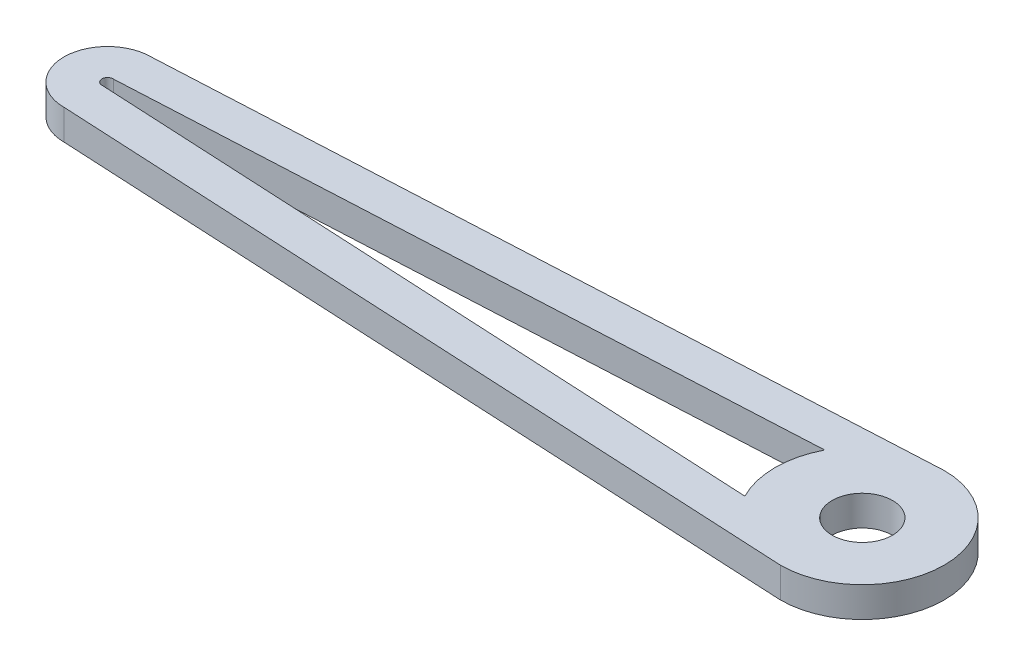
ISO-10303-21;
HEADER;
FILE_DESCRIPTION(('STEP AP214'),'2;1');
FILE_NAME('part.step','',(''),(''),'','','');
FILE_SCHEMA(('AUTOMOTIVE_DESIGN { 1 0 10303 214 1 1 1 1 }'));
ENDSEC;
DATA;
#1=APPLICATION_CONTEXT('core data for automotive mechanical design processes');
#2=APPLICATION_PROTOCOL_DEFINITION('international standard','automotive_design',2000,#1);
#3=PRODUCT_CONTEXT('',#1,'mechanical');
#4=PRODUCT('Part','Part','',(#3));
#5=PRODUCT_RELATED_PRODUCT_CATEGORY('part','',(#4));
#6=PRODUCT_DEFINITION_FORMATION('','',#4);
#7=PRODUCT_DEFINITION_CONTEXT('part definition',#1,'design');
#8=PRODUCT_DEFINITION('design','',#6,#7);
#9=PRODUCT_DEFINITION_SHAPE('','',#8);
#10=(LENGTH_UNIT() NAMED_UNIT(*) SI_UNIT(.MILLI.,.METRE.));
#11=(NAMED_UNIT(*) PLANE_ANGLE_UNIT() SI_UNIT($,.RADIAN.));
#12=(NAMED_UNIT(*) SI_UNIT($,.STERADIAN.) SOLID_ANGLE_UNIT());
#13=UNCERTAINTY_MEASURE_WITH_UNIT(LENGTH_MEASURE(1.E-05),#10,'distance_accuracy_value','');
#14=(GEOMETRIC_REPRESENTATION_CONTEXT(3) GLOBAL_UNCERTAINTY_ASSIGNED_CONTEXT((#13)) GLOBAL_UNIT_ASSIGNED_CONTEXT((#10,
#11,#12)) REPRESENTATION_CONTEXT('',''));
#15=CARTESIAN_POINT('',(0.,0.,0.));
#16=DIRECTION('',(0.,0.,1.));
#17=DIRECTION('',(1.,0.,0.));
#18=AXIS2_PLACEMENT_3D('',#15,#16,#17);
#19=CARTESIAN_POINT('',(-18.7071955690592,0.79375,0.));
#20=DIRECTION('',(0.,1.,0.));
#21=DIRECTION('',(0.,0.,1.));
#22=AXIS2_PLACEMENT_3D('',#19,#20,#21);
#23=PLANE('',#22);
#24=CARTESIAN_POINT('',(21.,0.79375,0.));
#25=DIRECTION('',(0.,1.,0.));
#26=DIRECTION('',(0.,0.,1.));
#27=AXIS2_PLACEMENT_3D('',#24,#25,#26);
#28=CIRCLE('',#27,1.5875);
#29=CARTESIAN_POINT('',(21.,0.79375,1.58749999999999));
#30=VERTEX_POINT('',#29);
#31=EDGE_CURVE('E134',#30,#30,#28,.T.);
#32=ORIENTED_EDGE('',*,*,#31,.F.);
#33=EDGE_LOOP('',(#32));
#34=FACE_BOUND('',#33,.T.);
#35=CARTESIAN_POINT('',(-18.7071955690592,0.79375,0.));
#36=DIRECTION('',(0.,1.,0.));
#37=DIRECTION('',(0.,0.,1.));
#38=AXIS2_PLACEMENT_3D('',#35,#36,#37);
#39=CIRCLE('',#38,2.29280443094082);
#40=CARTESIAN_POINT('',(-18.7071955690592,0.79375,-2.29280443094082));
#41=VERTEX_POINT('',#40);
#42=CARTESIAN_POINT('',(-18.7071955690592,0.79375,2.29280443094082));
#43=VERTEX_POINT('',#42);
#44=EDGE_CURVE('E140',#41,#43,#39,.T.);
#45=ORIENTED_EDGE('',*,*,#44,.T.);
#46=DIRECTION('',(0.998710837112563,0.,0.0507608494208332));
#47=VECTOR('',#46,1.);
#48=CARTESIAN_POINT('',(-18.7071955690592,0.79375,2.29280443094082));
#49=LINE('',#48,#47);
#50=CARTESIAN_POINT('',(21.,0.79375,4.31097715952754));
#51=VERTEX_POINT('',#50);
#52=EDGE_CURVE('E143',#43,#51,#49,.T.);
#53=ORIENTED_EDGE('',*,*,#52,.T.);
#54=CARTESIAN_POINT('',(21.,0.79375,0.));
#55=DIRECTION('',(0.,1.,0.));
#56=DIRECTION('',(0.,0.,1.));
#57=AXIS2_PLACEMENT_3D('',#54,#55,#56);
#58=CIRCLE('',#57,4.31097715952755);
#59=CARTESIAN_POINT('',(21.,0.79375,-4.31097715952756));
#60=VERTEX_POINT('',#59);
#61=EDGE_CURVE('E146',#51,#60,#58,.T.);
#62=ORIENTED_EDGE('',*,*,#61,.T.);
#63=DIRECTION('',(-0.998710837112563,0.,0.0507608494208336));
#64=VECTOR('',#63,1.);
#65=CARTESIAN_POINT('',(-18.7071955690592,0.79375,-2.29280443094082));
#66=LINE('',#65,#64);
#67=EDGE_CURVE('E148',#60,#41,#66,.T.);
#68=ORIENTED_EDGE('',*,*,#67,.T.);
#69=EDGE_LOOP('',(#45,#53,#62,#68));
#70=FACE_BOUND('',#69,.T.);
#71=DIRECTION('',(0.998710837112562,0.,0.0507608494208332));
#72=VECTOR('',#71,1.);
#73=CARTESIAN_POINT('',(-18.6804625738071,0.79375,0.291581518178759));
#74=LINE('',#73,#72);
#75=CARTESIAN_POINT('',(-18.6804625738071,0.79375,0.291581518178759));
#76=VERTEX_POINT('',#75);
#77=CARTESIAN_POINT('',(16.9219567332854,0.79375,2.10112335782638));
#78=VERTEX_POINT('',#77);
#79=EDGE_CURVE('E106',#76,#78,#74,.T.);
#80=ORIENTED_EDGE('',*,*,#79,.F.);
#81=CARTESIAN_POINT('',(-18.7071955690592,0.79375,0.));
#82=DIRECTION('',(0.,1.,0.));
#83=DIRECTION('',(0.,0.,1.));
#84=AXIS2_PLACEMENT_3D('',#81,#82,#83);
#85=CIRCLE('',#84,0.292804430940822);
#86=CARTESIAN_POINT('',(-18.6804625738071,0.79375,-0.291581518178759));
#87=VERTEX_POINT('',#86);
#88=EDGE_CURVE('E98',#87,#76,#85,.T.);
#89=ORIENTED_EDGE('',*,*,#88,.F.);
#90=DIRECTION('',(-0.998710837112562,0.,0.0507608494208336));
#91=VECTOR('',#90,1.);
#92=CARTESIAN_POINT('',(-18.6804625738071,0.79375,-0.291581518178759));
#93=LINE('',#92,#91);
#94=CARTESIAN_POINT('',(16.9219567332854,0.79375,-2.1011233578264));
#95=VERTEX_POINT('',#94);
#96=EDGE_CURVE('E120',#95,#87,#93,.T.);
#97=ORIENTED_EDGE('',*,*,#96,.F.);
#98=CARTESIAN_POINT('',(21.,0.79375,0.));
#99=DIRECTION('',(0.,-1.,0.));
#100=DIRECTION('',(0.,0.,1.));
#101=AXIS2_PLACEMENT_3D('',#98,#99,#100);
#102=CIRCLE('',#101,4.5875);
#103=EDGE_CURVE('E118',#78,#95,#102,.T.);
#104=ORIENTED_EDGE('',*,*,#103,.F.);
#105=EDGE_LOOP('',(#80,#89,#97,#104));
#106=FACE_BOUND('',#105,.T.);
#107=ADVANCED_FACE('F33',(#34,#70,#106),#23,.T.);
#108=CARTESIAN_POINT('',(-18.7071955690592,-0.79375,0.));
#109=DIRECTION('',(0.,1.,0.));
#110=DIRECTION('',(0.,0.,1.));
#111=AXIS2_PLACEMENT_3D('',#108,#109,#110);
#112=PLANE('',#111);
#113=CARTESIAN_POINT('',(21.,-0.79375,0.));
#114=DIRECTION('',(0.,1.,0.));
#115=DIRECTION('',(0.,0.,1.));
#116=AXIS2_PLACEMENT_3D('',#113,#114,#115);
#117=CIRCLE('',#116,1.5875);
#118=CARTESIAN_POINT('',(21.,-0.79375,1.58749999999999));
#119=VERTEX_POINT('',#118);
#120=EDGE_CURVE('E114',#119,#119,#117,.T.);
#121=ORIENTED_EDGE('',*,*,#120,.T.);
#122=EDGE_LOOP('',(#121));
#123=FACE_BOUND('',#122,.T.);
#124=CARTESIAN_POINT('',(-18.7071955690592,-0.79375,0.));
#125=DIRECTION('',(0.,1.,0.));
#126=DIRECTION('',(0.,0.,1.));
#127=AXIS2_PLACEMENT_3D('',#124,#125,#126);
#128=CIRCLE('',#127,2.29280443094082);
#129=CARTESIAN_POINT('',(-18.7071955690592,-0.79375,-2.29280443094082));
#130=VERTEX_POINT('',#129);
#131=CARTESIAN_POINT('',(-18.7071955690592,-0.79375,2.29280443094082));
#132=VERTEX_POINT('',#131);
#133=EDGE_CURVE('E137',#130,#132,#128,.T.);
#134=ORIENTED_EDGE('',*,*,#133,.F.);
#135=DIRECTION('',(-0.998710837112563,0.,0.0507608494208336));
#136=VECTOR('',#135,1.);
#137=CARTESIAN_POINT('',(-18.7071955690592,-0.79375,-2.29280443094082));
#138=LINE('',#137,#136);
#139=CARTESIAN_POINT('',(21.,-0.79375,-4.31097715952756));
#140=VERTEX_POINT('',#139);
#141=EDGE_CURVE('E144',#140,#130,#138,.T.);
#142=ORIENTED_EDGE('',*,*,#141,.F.);
#143=CARTESIAN_POINT('',(21.,-0.79375,0.));
#144=DIRECTION('',(0.,1.,0.));
#145=DIRECTION('',(0.,0.,1.));
#146=AXIS2_PLACEMENT_3D('',#143,#144,#145);
#147=CIRCLE('',#146,4.31097715952755);
#148=CARTESIAN_POINT('',(21.,-0.79375,4.31097715952754));
#149=VERTEX_POINT('',#148);
#150=EDGE_CURVE('E155',#149,#140,#147,.T.);
#151=ORIENTED_EDGE('',*,*,#150,.F.);
#152=DIRECTION('',(0.998710837112563,0.,0.0507608494208332));
#153=VECTOR('',#152,1.);
#154=CARTESIAN_POINT('',(-18.7071955690592,-0.79375,2.29280443094082));
#155=LINE('',#154,#153);
#156=EDGE_CURVE('E153',#132,#149,#155,.T.);
#157=ORIENTED_EDGE('',*,*,#156,.F.);
#158=EDGE_LOOP('',(#134,#142,#151,#157));
#159=FACE_BOUND('',#158,.T.);
#160=CARTESIAN_POINT('',(-18.7071955690592,-0.79375,0.));
#161=DIRECTION('',(0.,1.,0.));
#162=DIRECTION('',(0.,0.,1.));
#163=AXIS2_PLACEMENT_3D('',#160,#161,#162);
#164=CIRCLE('',#163,0.292804430940822);
#165=CARTESIAN_POINT('',(-18.6804625738071,-0.79375,-0.291581518178759));
#166=VERTEX_POINT('',#165);
#167=CARTESIAN_POINT('',(-18.6804625738071,-0.79375,0.291581518178759));
#168=VERTEX_POINT('',#167);
#169=EDGE_CURVE('E56',#166,#168,#164,.T.);
#170=ORIENTED_EDGE('',*,*,#169,.T.);
#171=DIRECTION('',(0.998710837112562,0.,0.0507608494208332));
#172=VECTOR('',#171,1.);
#173=CARTESIAN_POINT('',(-18.6804625738071,-0.79375,0.291581518178759));
#174=LINE('',#173,#172);
#175=CARTESIAN_POINT('',(16.9219567332854,-0.79375,2.10112335782638));
#176=VERTEX_POINT('',#175);
#177=EDGE_CURVE('E113',#168,#176,#174,.T.);
#178=ORIENTED_EDGE('',*,*,#177,.T.);
#179=CARTESIAN_POINT('',(21.,-0.79375,0.));
#180=DIRECTION('',(0.,-1.,0.));
#181=DIRECTION('',(0.,0.,1.));
#182=AXIS2_PLACEMENT_3D('',#179,#180,#181);
#183=CIRCLE('',#182,4.5875);
#184=CARTESIAN_POINT('',(16.9219567332854,-0.79375,-2.1011233578264));
#185=VERTEX_POINT('',#184);
#186=EDGE_CURVE('E126',#176,#185,#183,.T.);
#187=ORIENTED_EDGE('',*,*,#186,.T.);
#188=DIRECTION('',(-0.998710837112562,0.,0.0507608494208336));
#189=VECTOR('',#188,1.);
#190=CARTESIAN_POINT('',(-18.6804625738071,-0.79375,-0.291581518178759));
#191=LINE('',#190,#189);
#192=EDGE_CURVE('E107',#185,#166,#191,.T.);
#193=ORIENTED_EDGE('',*,*,#192,.T.);
#194=EDGE_LOOP('',(#170,#178,#187,#193));
#195=FACE_BOUND('',#194,.T.);
#196=ADVANCED_FACE('F173',(#123,#159,#195),#112,.F.);
#197=CARTESIAN_POINT('',(-18.7071955690592,0.79375,0.));
#198=DIRECTION('',(0.,-1.,0.));
#199=DIRECTION('',(0.,0.,-1.));
#200=AXIS2_PLACEMENT_3D('',#197,#198,#199);
#201=CYLINDRICAL_SURFACE('',#200,2.29280443094082);
#202=ORIENTED_EDGE('',*,*,#133,.T.);
#203=DIRECTION('',(0.,-1.,0.));
#204=VECTOR('',#203,1.);
#205=CARTESIAN_POINT('',(-18.7071955690592,0.79375,2.29280443094082));
#206=LINE('',#205,#204);
#207=EDGE_CURVE('E11',#43,#132,#206,.T.);
#208=ORIENTED_EDGE('',*,*,#207,.F.);
#209=ORIENTED_EDGE('',*,*,#44,.F.);
#210=DIRECTION('',(0.,-1.,0.));
#211=VECTOR('',#210,1.);
#212=CARTESIAN_POINT('',(-18.7071955690592,0.79375,-2.29280443094082));
#213=LINE('',#212,#211);
#214=EDGE_CURVE('E150',#41,#130,#213,.T.);
#215=ORIENTED_EDGE('',*,*,#214,.T.);
#216=EDGE_LOOP('',(#202,#208,#209,#215));
#217=FACE_BOUND('',#216,.T.);
#218=ADVANCED_FACE('F35',(#217),#201,.T.);
#219=CARTESIAN_POINT('',(-18.7071955690592,0.79375,2.29280443094082));
#220=DIRECTION('',(0.0507608494208332,0.,-0.998710837112562));
#221=DIRECTION('',(-0.998710837112563,0.,-0.0507608494208332));
#222=AXIS2_PLACEMENT_3D('',#219,#220,#221);
#223=PLANE('',#222);
#224=ORIENTED_EDGE('',*,*,#156,.T.);
#225=DIRECTION('',(0.,-1.,0.));
#226=VECTOR('',#225,1.);
#227=CARTESIAN_POINT('',(21.,0.79375,4.31097715952754));
#228=LINE('',#227,#226);
#229=EDGE_CURVE('E41',#51,#149,#228,.T.);
#230=ORIENTED_EDGE('',*,*,#229,.F.);
#231=ORIENTED_EDGE('',*,*,#52,.F.);
#232=ORIENTED_EDGE('',*,*,#207,.T.);
#233=EDGE_LOOP('',(#224,#230,#231,#232));
#234=FACE_BOUND('',#233,.T.);
#235=ADVANCED_FACE('F183',(#234),#223,.F.);
#236=CARTESIAN_POINT('',(21.,0.79375,0.));
#237=DIRECTION('',(0.,-1.,0.));
#238=DIRECTION('',(0.,0.,-1.));
#239=AXIS2_PLACEMENT_3D('',#236,#237,#238);
#240=CYLINDRICAL_SURFACE('',#239,4.31097715952755);
#241=ORIENTED_EDGE('',*,*,#150,.T.);
#242=DIRECTION('',(0.,-1.,0.));
#243=VECTOR('',#242,1.);
#244=CARTESIAN_POINT('',(21.,0.79375,-4.31097715952756));
#245=LINE('',#244,#243);
#246=EDGE_CURVE('E160',#60,#140,#245,.T.);
#247=ORIENTED_EDGE('',*,*,#246,.F.);
#248=ORIENTED_EDGE('',*,*,#61,.F.);
#249=ORIENTED_EDGE('',*,*,#229,.T.);
#250=EDGE_LOOP('',(#241,#247,#248,#249));
#251=FACE_BOUND('',#250,.T.);
#252=ADVANCED_FACE('F167',(#251),#240,.T.);
#253=CARTESIAN_POINT('',(-18.7071955690592,0.79375,-2.29280443094082));
#254=DIRECTION('',(0.0507608494208336,0.,0.998710837112562));
#255=DIRECTION('',(0.998710837112563,0.,-0.0507608494208336));
#256=AXIS2_PLACEMENT_3D('',#253,#254,#255);
#257=PLANE('',#256);
#258=ORIENTED_EDGE('',*,*,#141,.T.);
#259=ORIENTED_EDGE('',*,*,#214,.F.);
#260=ORIENTED_EDGE('',*,*,#67,.F.);
#261=ORIENTED_EDGE('',*,*,#246,.T.);
#262=EDGE_LOOP('',(#258,#259,#260,#261));
#263=FACE_BOUND('',#262,.T.);
#264=ADVANCED_FACE('F177',(#263),#257,.F.);
#265=CARTESIAN_POINT('',(21.,0.79375,0.));
#266=DIRECTION('',(0.,-1.,0.));
#267=DIRECTION('',(0.,0.,-1.));
#268=AXIS2_PLACEMENT_3D('',#265,#266,#267);
#269=CYLINDRICAL_SURFACE('',#268,1.5875);
#270=ORIENTED_EDGE('',*,*,#31,.T.);
#271=EDGE_LOOP('',(#270));
#272=FACE_BOUND('',#271,.T.);
#273=ORIENTED_EDGE('',*,*,#120,.F.);
#274=EDGE_LOOP('',(#273));
#275=FACE_BOUND('',#274,.T.);
#276=ADVANCED_FACE('F200',(#272,#275),#269,.F.);
#277=CARTESIAN_POINT('',(-18.7071955690592,0.79375,0.));
#278=DIRECTION('',(0.,-1.,0.));
#279=DIRECTION('',(0.,0.,-1.));
#280=AXIS2_PLACEMENT_3D('',#277,#278,#279);
#281=CYLINDRICAL_SURFACE('',#280,0.292804430940822);
#282=ORIENTED_EDGE('',*,*,#169,.F.);
#283=DIRECTION('',(0.,-1.,0.));
#284=VECTOR('',#283,1.);
#285=CARTESIAN_POINT('',(-18.6804625738071,0.79375,-0.291581518178759));
#286=LINE('',#285,#284);
#287=EDGE_CURVE('E102',#87,#166,#286,.T.);
#288=ORIENTED_EDGE('',*,*,#287,.F.);
#289=ORIENTED_EDGE('',*,*,#88,.T.);
#290=DIRECTION('',(0.,-1.,0.));
#291=VECTOR('',#290,1.);
#292=CARTESIAN_POINT('',(-18.6804625738071,0.79375,0.291581518178759));
#293=LINE('',#292,#291);
#294=EDGE_CURVE('E101',#76,#168,#293,.T.);
#295=ORIENTED_EDGE('',*,*,#294,.T.);
#296=EDGE_LOOP('',(#282,#288,#289,#295));
#297=FACE_BOUND('',#296,.T.);
#298=ADVANCED_FACE('F100',(#297),#281,.F.);
#299=CARTESIAN_POINT('',(-18.6804625738071,0.79375,0.291581518178759));
#300=DIRECTION('',(0.0507608494208332,0.,-0.998710837112562));
#301=DIRECTION('',(-0.998710837112563,0.,-0.0507608494208332));
#302=AXIS2_PLACEMENT_3D('',#299,#300,#301);
#303=PLANE('',#302);
#304=ORIENTED_EDGE('',*,*,#177,.F.);
#305=ORIENTED_EDGE('',*,*,#294,.F.);
#306=ORIENTED_EDGE('',*,*,#79,.T.);
#307=DIRECTION('',(0.,-1.,0.));
#308=VECTOR('',#307,1.);
#309=CARTESIAN_POINT('',(16.9219567332854,0.79375,2.10112335782638));
#310=LINE('',#309,#308);
#311=EDGE_CURVE('E115',#78,#176,#310,.T.);
#312=ORIENTED_EDGE('',*,*,#311,.T.);
#313=EDGE_LOOP('',(#304,#305,#306,#312));
#314=FACE_BOUND('',#313,.T.);
#315=ADVANCED_FACE('F110',(#314),#303,.T.);
#316=CARTESIAN_POINT('',(21.,0.79375,0.));
#317=DIRECTION('',(0.,-1.,0.));
#318=DIRECTION('',(0.,0.,-1.));
#319=AXIS2_PLACEMENT_3D('',#316,#317,#318);
#320=CYLINDRICAL_SURFACE('',#319,4.5875);
#321=ORIENTED_EDGE('',*,*,#186,.F.);
#322=ORIENTED_EDGE('',*,*,#311,.F.);
#323=ORIENTED_EDGE('',*,*,#103,.T.);
#324=DIRECTION('',(0.,-1.,0.));
#325=VECTOR('',#324,1.);
#326=CARTESIAN_POINT('',(16.9219567332854,0.79375,-2.1011233578264));
#327=LINE('',#326,#325);
#328=EDGE_CURVE('E48',#95,#185,#327,.T.);
#329=ORIENTED_EDGE('',*,*,#328,.T.);
#330=EDGE_LOOP('',(#321,#322,#323,#329));
#331=FACE_BOUND('',#330,.T.);
#332=ADVANCED_FACE('F216',(#331),#320,.T.);
#333=CARTESIAN_POINT('',(-18.6804625738071,0.79375,-0.291581518178759));
#334=DIRECTION('',(0.0507608494208336,0.,0.998710837112562));
#335=DIRECTION('',(0.998710837112563,0.,-0.0507608494208336));
#336=AXIS2_PLACEMENT_3D('',#333,#334,#335);
#337=PLANE('',#336);
#338=ORIENTED_EDGE('',*,*,#192,.F.);
#339=ORIENTED_EDGE('',*,*,#328,.F.);
#340=ORIENTED_EDGE('',*,*,#96,.T.);
#341=ORIENTED_EDGE('',*,*,#287,.T.);
#342=EDGE_LOOP('',(#338,#339,#340,#341));
#343=FACE_BOUND('',#342,.T.);
#344=ADVANCED_FACE('F221',(#343),#337,.T.);
#345=CLOSED_SHELL('',(#107,#196,#218,#235,#252,#264,#276,#298,#315,#332,#344));
#346=MANIFOLD_SOLID_BREP('B2',#345);
#347=ADVANCED_BREP_SHAPE_REPRESENTATION('',(#18,#346),#14);
#348=SHAPE_DEFINITION_REPRESENTATION(#9,#347);
ENDSEC;
END-ISO-10303-21;
